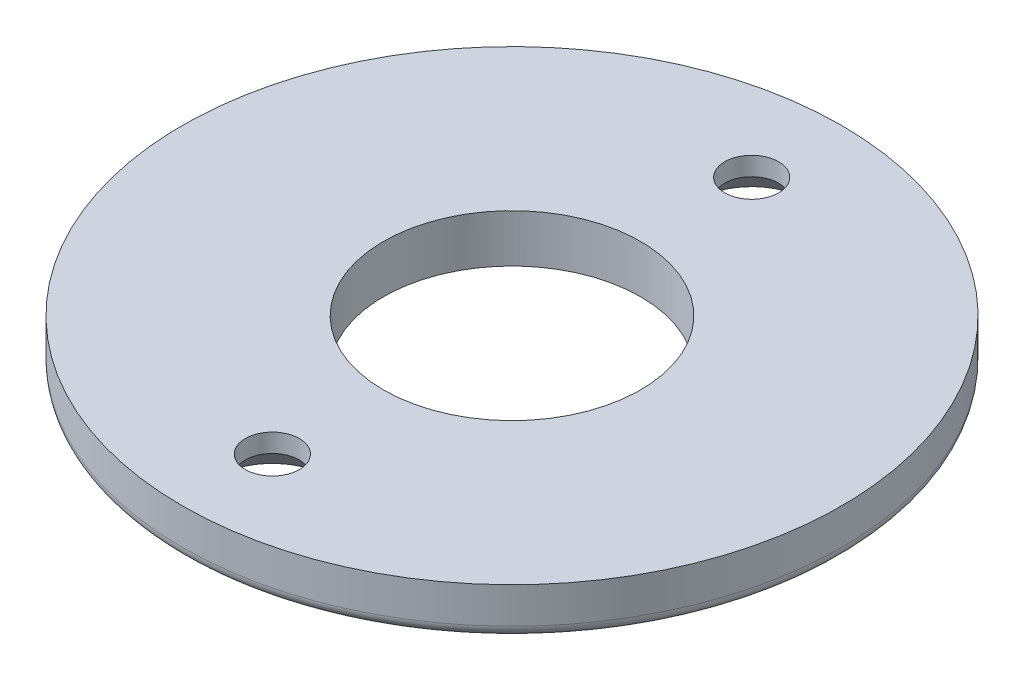
ISO-10303-21;
HEADER;
FILE_DESCRIPTION(('STEP AP214'),'2;1');
FILE_NAME('part.step','',(''),(''),'','','');
FILE_SCHEMA(('AUTOMOTIVE_DESIGN { 1 0 10303 214 1 1 1 1 }'));
ENDSEC;
DATA;
#1=APPLICATION_CONTEXT('core data for automotive mechanical design processes');
#2=APPLICATION_PROTOCOL_DEFINITION('international standard','automotive_design',2000,#1);
#3=PRODUCT_CONTEXT('',#1,'mechanical');
#4=PRODUCT('Part','Part','',(#3));
#5=PRODUCT_RELATED_PRODUCT_CATEGORY('part','',(#4));
#6=PRODUCT_DEFINITION_FORMATION('','',#4);
#7=PRODUCT_DEFINITION_CONTEXT('part definition',#1,'design');
#8=PRODUCT_DEFINITION('design','',#6,#7);
#9=PRODUCT_DEFINITION_SHAPE('','',#8);
#10=(LENGTH_UNIT() NAMED_UNIT(*) SI_UNIT(.MILLI.,.METRE.));
#11=(NAMED_UNIT(*) PLANE_ANGLE_UNIT() SI_UNIT($,.RADIAN.));
#12=(NAMED_UNIT(*) SI_UNIT($,.STERADIAN.) SOLID_ANGLE_UNIT());
#13=UNCERTAINTY_MEASURE_WITH_UNIT(LENGTH_MEASURE(1.E-05),#10,'distance_accuracy_value','');
#14=(GEOMETRIC_REPRESENTATION_CONTEXT(3) GLOBAL_UNCERTAINTY_ASSIGNED_CONTEXT((#13)) GLOBAL_UNIT_ASSIGNED_CONTEXT((#10,
#11,#12)) REPRESENTATION_CONTEXT('',''));
#15=CARTESIAN_POINT('',(0.,0.,0.));
#16=DIRECTION('',(0.,0.,1.));
#17=DIRECTION('',(1.,0.,0.));
#18=AXIS2_PLACEMENT_3D('',#15,#16,#17);
#19=CARTESIAN_POINT('',(0.,0.,0.));
#20=DIRECTION('',(0.,-1.,0.));
#21=DIRECTION('',(0.,0.,-1.));
#22=AXIS2_PLACEMENT_3D('',#19,#20,#21);
#23=PLANE('',#22);
#24=CARTESIAN_POINT('',(0.,0.,0.));
#25=DIRECTION('',(0.,-1.,0.));
#26=DIRECTION('',(0.,0.,-1.));
#27=AXIS2_PLACEMENT_3D('',#24,#25,#26);
#28=CIRCLE('',#27,10.7320508075689);
#29=CARTESIAN_POINT('',(0.,0.,-10.7320508075689));
#30=VERTEX_POINT('',#29);
#31=EDGE_CURVE('E82',#30,#30,#28,.T.);
#32=ORIENTED_EDGE('',*,*,#31,.F.);
#33=EDGE_LOOP('',(#32));
#34=FACE_BOUND('',#33,.T.);
#35=CARTESIAN_POINT('',(0.,0.,0.));
#36=DIRECTION('',(0.,-1.,0.));
#37=DIRECTION('',(0.,0.,-1.));
#38=AXIS2_PLACEMENT_3D('',#35,#36,#37);
#39=CIRCLE('',#38,26.5);
#40=CARTESIAN_POINT('',(0.,0.,-26.5));
#41=VERTEX_POINT('',#40);
#42=EDGE_CURVE('E10',#41,#41,#39,.T.);
#43=ORIENTED_EDGE('',*,*,#42,.T.);
#44=EDGE_LOOP('',(#43));
#45=FACE_BOUND('',#44,.T.);
#46=CARTESIAN_POINT('',(0.,0.,-20.));
#47=DIRECTION('',(0.,-1.,0.));
#48=DIRECTION('',(0.,0.,-1.));
#49=AXIS2_PLACEMENT_3D('',#46,#47,#48);
#50=CIRCLE('',#49,4.7);
#51=CARTESIAN_POINT('',(0.,0.,-24.7));
#52=VERTEX_POINT('',#51);
#53=EDGE_CURVE('E78',#52,#52,#50,.T.);
#54=ORIENTED_EDGE('',*,*,#53,.F.);
#55=EDGE_LOOP('',(#54));
#56=FACE_BOUND('',#55,.T.);
#57=CARTESIAN_POINT('',(0.,0.,20.));
#58=DIRECTION('',(0.,-1.,0.));
#59=DIRECTION('',(0.,0.,-1.));
#60=AXIS2_PLACEMENT_3D('',#57,#58,#59);
#61=CIRCLE('',#60,4.7);
#62=CARTESIAN_POINT('',(0.,0.,15.3));
#63=VERTEX_POINT('',#62);
#64=EDGE_CURVE('E66',#63,#63,#61,.T.);
#65=ORIENTED_EDGE('',*,*,#64,.F.);
#66=EDGE_LOOP('',(#65));
#67=FACE_BOUND('',#66,.T.);
#68=ADVANCED_FACE('F38',(#34,#45,#56,#67),#23,.T.);
#69=CARTESIAN_POINT('',(0.,0.,0.));
#70=DIRECTION('',(0.,1.,0.));
#71=DIRECTION('',(0.,0.,1.));
#72=AXIS2_PLACEMENT_3D('',#69,#70,#71);
#73=CYLINDRICAL_SURFACE('',#72,27.5);
#74=CARTESIAN_POINT('',(0.,0.999999999999998,0.));
#75=DIRECTION('',(0.,-1.,0.));
#76=DIRECTION('',(0.,0.,-1.));
#77=AXIS2_PLACEMENT_3D('',#74,#75,#76);
#78=CIRCLE('',#77,27.5);
#79=CARTESIAN_POINT('',(0.,0.999999999999998,-27.5));
#80=VERTEX_POINT('',#79);
#81=EDGE_CURVE('E46',#80,#80,#78,.F.);
#82=ORIENTED_EDGE('',*,*,#81,.T.);
#83=EDGE_LOOP('',(#82));
#84=FACE_BOUND('',#83,.T.);
#85=CARTESIAN_POINT('',(0.,4.,0.));
#86=DIRECTION('',(0.,1.,0.));
#87=DIRECTION('',(0.,0.,1.));
#88=AXIS2_PLACEMENT_3D('',#85,#86,#87);
#89=CIRCLE('',#88,27.5);
#90=CARTESIAN_POINT('',(0.,4.,27.5));
#91=VERTEX_POINT('',#90);
#92=EDGE_CURVE('E51',#91,#91,#89,.T.);
#93=ORIENTED_EDGE('',*,*,#92,.F.);
#94=EDGE_LOOP('',(#93));
#95=FACE_BOUND('',#94,.T.);
#96=ADVANCED_FACE('F96',(#84,#95),#73,.T.);
#97=CARTESIAN_POINT('',(-27.5,4.,0.));
#98=DIRECTION('',(0.,1.,0.));
#99=DIRECTION('',(0.,0.,1.));
#100=AXIS2_PLACEMENT_3D('',#97,#98,#99);
#101=PLANE('',#100);
#102=CARTESIAN_POINT('',(0.,4.,-20.));
#103=DIRECTION('',(0.,1.,0.));
#104=DIRECTION('',(0.,0.,1.));
#105=AXIS2_PLACEMENT_3D('',#102,#103,#104);
#106=CIRCLE('',#105,2.25);
#107=CARTESIAN_POINT('',(0.,4.,-17.75));
#108=VERTEX_POINT('',#107);
#109=EDGE_CURVE('E70',#108,#108,#106,.T.);
#110=ORIENTED_EDGE('',*,*,#109,.F.);
#111=EDGE_LOOP('',(#110));
#112=FACE_BOUND('',#111,.T.);
#113=CARTESIAN_POINT('',(0.,4.,20.));
#114=DIRECTION('',(0.,1.,0.));
#115=DIRECTION('',(0.,0.,1.));
#116=AXIS2_PLACEMENT_3D('',#113,#114,#115);
#117=CIRCLE('',#116,2.25);
#118=CARTESIAN_POINT('',(0.,4.,22.25));
#119=VERTEX_POINT('',#118);
#120=EDGE_CURVE('E56',#119,#119,#117,.T.);
#121=ORIENTED_EDGE('',*,*,#120,.F.);
#122=EDGE_LOOP('',(#121));
#123=FACE_BOUND('',#122,.T.);
#124=ORIENTED_EDGE('',*,*,#92,.T.);
#125=EDGE_LOOP('',(#124));
#126=FACE_BOUND('',#125,.T.);
#127=CARTESIAN_POINT('',(0.,4.,0.));
#128=DIRECTION('',(0.,1.,0.));
#129=DIRECTION('',(0.,0.,1.));
#130=AXIS2_PLACEMENT_3D('',#127,#128,#129);
#131=CIRCLE('',#130,10.7320508075689);
#132=CARTESIAN_POINT('',(0.,4.,10.7320508075689));
#133=VERTEX_POINT('',#132);
#134=EDGE_CURVE('E86',#133,#133,#131,.T.);
#135=ORIENTED_EDGE('',*,*,#134,.F.);
#136=EDGE_LOOP('',(#135));
#137=FACE_BOUND('',#136,.T.);
#138=ADVANCED_FACE('F93',(#112,#123,#126,#137),#101,.T.);
#139=CARTESIAN_POINT('',(0.,0.,20.));
#140=DIRECTION('',(0.,-1.,0.));
#141=DIRECTION('',(0.,0.,-1.));
#142=AXIS2_PLACEMENT_3D('',#139,#140,#141);
#143=CYLINDRICAL_SURFACE('',#142,2.25);
#144=CARTESIAN_POINT('',(0.,2.45,20.));
#145=DIRECTION('',(0.,-1.,0.));
#146=DIRECTION('',(0.,0.,-1.));
#147=AXIS2_PLACEMENT_3D('',#144,#145,#146);
#148=CIRCLE('',#147,2.25);
#149=CARTESIAN_POINT('',(0.,2.45,17.75));
#150=VERTEX_POINT('',#149);
#151=EDGE_CURVE('E62',#150,#150,#148,.T.);
#152=ORIENTED_EDGE('',*,*,#151,.T.);
#153=EDGE_LOOP('',(#152));
#154=FACE_BOUND('',#153,.T.);
#155=ORIENTED_EDGE('',*,*,#120,.T.);
#156=EDGE_LOOP('',(#155));
#157=FACE_BOUND('',#156,.T.);
#158=ADVANCED_FACE('F95',(#154,#157),#143,.F.);
#159=CARTESIAN_POINT('',(0.,0.,20.));
#160=DIRECTION('',(0.,-1.,0.));
#161=DIRECTION('',(0.,0.,-1.));
#162=AXIS2_PLACEMENT_3D('',#159,#160,#161);
#163=CONICAL_SURFACE('',#162,4.7,0.785398163397448);
#164=ORIENTED_EDGE('',*,*,#151,.F.);
#165=EDGE_LOOP('',(#164));
#166=FACE_BOUND('',#165,.T.);
#167=ORIENTED_EDGE('',*,*,#64,.T.);
#168=EDGE_LOOP('',(#167));
#169=FACE_BOUND('',#168,.T.);
#170=ADVANCED_FACE('F104',(#166,#169),#163,.F.);
#171=CARTESIAN_POINT('',(0.,0.,-20.));
#172=DIRECTION('',(0.,-1.,0.));
#173=DIRECTION('',(0.,0.,-1.));
#174=AXIS2_PLACEMENT_3D('',#171,#172,#173);
#175=CYLINDRICAL_SURFACE('',#174,2.25);
#176=CARTESIAN_POINT('',(0.,2.45,-20.));
#177=DIRECTION('',(0.,-1.,0.));
#178=DIRECTION('',(0.,0.,-1.));
#179=AXIS2_PLACEMENT_3D('',#176,#177,#178);
#180=CIRCLE('',#179,2.25);
#181=CARTESIAN_POINT('',(0.,2.45,-22.25));
#182=VERTEX_POINT('',#181);
#183=EDGE_CURVE('E74',#182,#182,#180,.T.);
#184=ORIENTED_EDGE('',*,*,#183,.T.);
#185=EDGE_LOOP('',(#184));
#186=FACE_BOUND('',#185,.T.);
#187=ORIENTED_EDGE('',*,*,#109,.T.);
#188=EDGE_LOOP('',(#187));
#189=FACE_BOUND('',#188,.T.);
#190=ADVANCED_FACE('F123',(#186,#189),#175,.F.);
#191=CARTESIAN_POINT('',(0.,0.,-20.));
#192=DIRECTION('',(0.,-1.,0.));
#193=DIRECTION('',(0.,0.,-1.));
#194=AXIS2_PLACEMENT_3D('',#191,#192,#193);
#195=CONICAL_SURFACE('',#194,4.7,0.785398163397448);
#196=ORIENTED_EDGE('',*,*,#183,.F.);
#197=EDGE_LOOP('',(#196));
#198=FACE_BOUND('',#197,.T.);
#199=ORIENTED_EDGE('',*,*,#53,.T.);
#200=EDGE_LOOP('',(#199));
#201=FACE_BOUND('',#200,.T.);
#202=ADVANCED_FACE('F129',(#198,#201),#195,.F.);
#203=CARTESIAN_POINT('',(0.,0.999999999999998,0.));
#204=DIRECTION('',(0.,-1.,0.));
#205=DIRECTION('',(0.,0.,-1.));
#206=AXIS2_PLACEMENT_3D('',#203,#204,#205);
#207=TOROIDAL_SURFACE('',#206,26.5,1.);
#208=ORIENTED_EDGE('',*,*,#42,.F.);
#209=EDGE_LOOP('',(#208));
#210=FACE_BOUND('',#209,.T.);
#211=ORIENTED_EDGE('',*,*,#81,.F.);
#212=EDGE_LOOP('',(#211));
#213=FACE_BOUND('',#212,.T.);
#214=ADVANCED_FACE('F40',(#210,#213),#207,.T.);
#215=CARTESIAN_POINT('',(0.,-6.,0.));
#216=DIRECTION('',(0.,1.,0.));
#217=DIRECTION('',(0.,0.,1.));
#218=AXIS2_PLACEMENT_3D('',#215,#216,#217);
#219=CYLINDRICAL_SURFACE('',#218,10.7320508075689);
#220=ORIENTED_EDGE('',*,*,#31,.T.);
#221=EDGE_LOOP('',(#220));
#222=FACE_BOUND('',#221,.T.);
#223=ORIENTED_EDGE('',*,*,#134,.T.);
#224=EDGE_LOOP('',(#223));
#225=FACE_BOUND('',#224,.T.);
#226=ADVANCED_FACE('F91',(#222,#225),#219,.F.);
#227=CLOSED_SHELL('',(#68,#96,#138,#158,#170,#190,#202,#214,#226));
#228=MANIFOLD_SOLID_BREP('B2',#227);
#229=ADVANCED_BREP_SHAPE_REPRESENTATION('',(#18,#228),#14);
#230=SHAPE_DEFINITION_REPRESENTATION(#9,#229);
ENDSEC;
END-ISO-10303-21;
